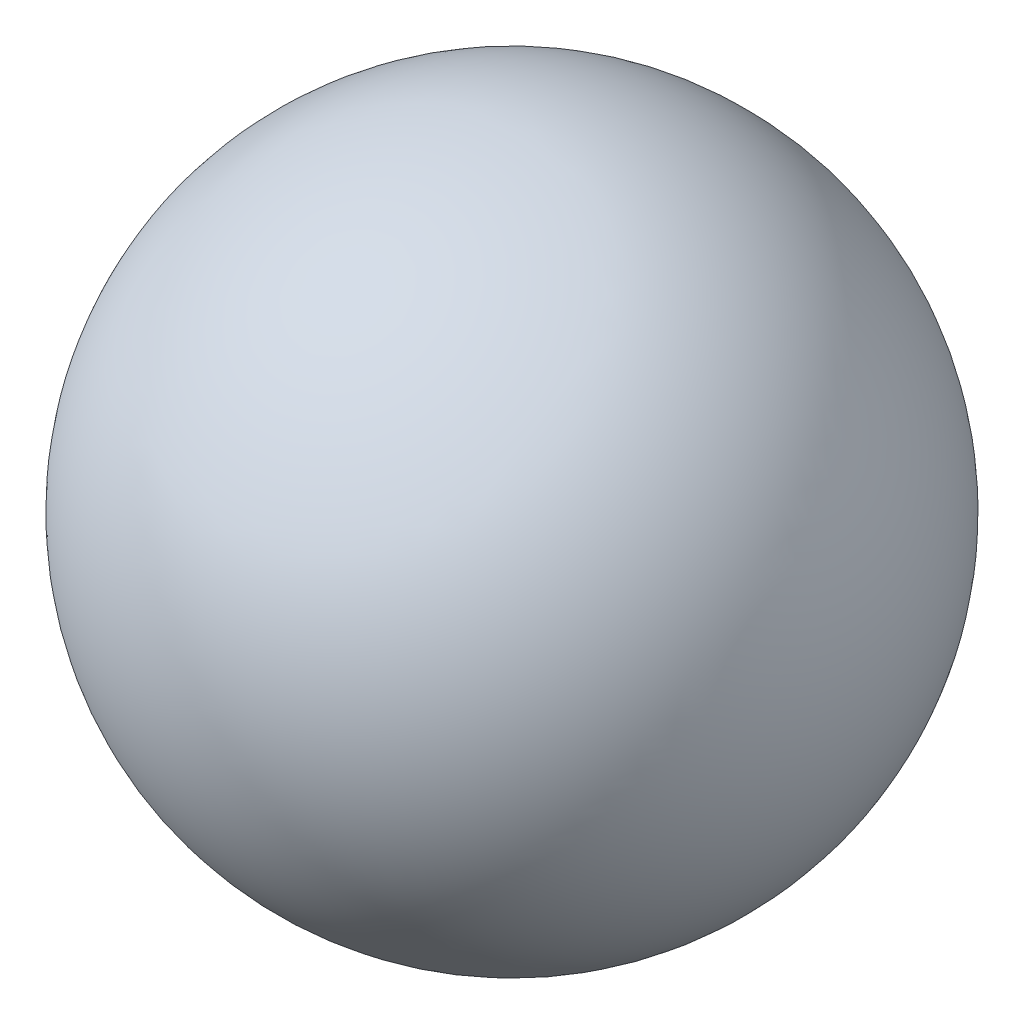
ISO-10303-21;
HEADER;
FILE_DESCRIPTION(('STEP AP214'),'2;1');
FILE_NAME('part.step','',(''),(''),'','','');
FILE_SCHEMA(('AUTOMOTIVE_DESIGN { 1 0 10303 214 1 1 1 1 }'));
ENDSEC;
DATA;
#1=APPLICATION_CONTEXT('core data for automotive mechanical design processes');
#2=APPLICATION_PROTOCOL_DEFINITION('international standard','automotive_design',2000,#1);
#3=PRODUCT_CONTEXT('',#1,'mechanical');
#4=PRODUCT('Part','Part','',(#3));
#5=PRODUCT_RELATED_PRODUCT_CATEGORY('part','',(#4));
#6=PRODUCT_DEFINITION_FORMATION('','',#4);
#7=PRODUCT_DEFINITION_CONTEXT('part definition',#1,'design');
#8=PRODUCT_DEFINITION('design','',#6,#7);
#9=PRODUCT_DEFINITION_SHAPE('','',#8);
#10=(LENGTH_UNIT() NAMED_UNIT(*) SI_UNIT(.MILLI.,.METRE.));
#11=(NAMED_UNIT(*) PLANE_ANGLE_UNIT() SI_UNIT($,.RADIAN.));
#12=(NAMED_UNIT(*) SI_UNIT($,.STERADIAN.) SOLID_ANGLE_UNIT());
#13=UNCERTAINTY_MEASURE_WITH_UNIT(LENGTH_MEASURE(1.E-05),#10,'distance_accuracy_value','');
#14=(GEOMETRIC_REPRESENTATION_CONTEXT(3) GLOBAL_UNCERTAINTY_ASSIGNED_CONTEXT((#13)) GLOBAL_UNIT_ASSIGNED_CONTEXT((#10,
#11,#12)) REPRESENTATION_CONTEXT('',''));
#15=CARTESIAN_POINT('',(0.,0.,0.));
#16=DIRECTION('',(0.,0.,1.));
#17=DIRECTION('',(1.,0.,0.));
#18=AXIS2_PLACEMENT_3D('',#15,#16,#17);
#19=CARTESIAN_POINT('',(0.,0.,0.));
#20=DIRECTION('',(-1.,0.,0.));
#21=DIRECTION('',(0.,1.,0.));
#22=AXIS2_PLACEMENT_3D('',#19,#20,#21);
#23=SPHERICAL_SURFACE('',#22,4.);
#24=CARTESIAN_POINT('',(-4.,0.,0.));
#25=VERTEX_POINT('',#24);
#26=VERTEX_LOOP('',#25);
#27=FACE_BOUND('',#26,.T.);
#28=ADVANCED_FACE('F346',(#27),#23,.T.);
#29=CLOSED_SHELL('',(#28));
#30=MANIFOLD_SOLID_BREP('B2',#29);
#31=ADVANCED_BREP_SHAPE_REPRESENTATION('',(#18,#30),#14);
#32=SHAPE_DEFINITION_REPRESENTATION(#9,#31);
ENDSEC;
END-ISO-10303-21;
